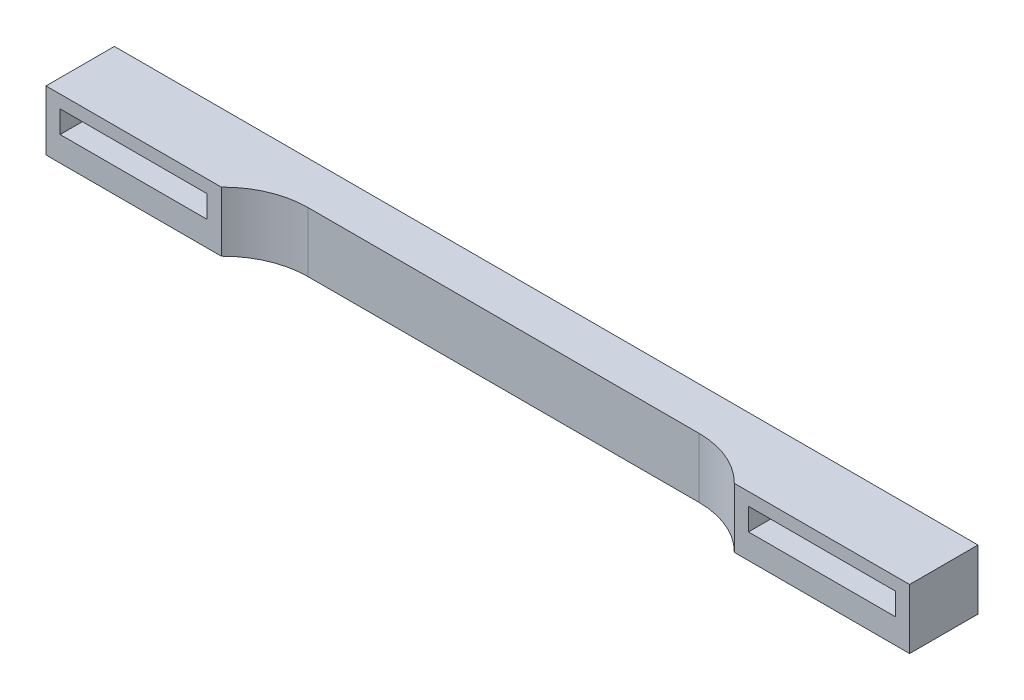
ISO-10303-21;
HEADER;
FILE_DESCRIPTION(('STEP AP214'),'2;1');
FILE_NAME('part.step','',(''),(''),'','','');
FILE_SCHEMA(('AUTOMOTIVE_DESIGN { 1 0 10303 214 1 1 1 1 }'));
ENDSEC;
DATA;
#1=APPLICATION_CONTEXT('core data for automotive mechanical design processes');
#2=APPLICATION_PROTOCOL_DEFINITION('international standard','automotive_design',2000,#1);
#3=PRODUCT_CONTEXT('',#1,'mechanical');
#4=PRODUCT('Part','Part','',(#3));
#5=PRODUCT_RELATED_PRODUCT_CATEGORY('part','',(#4));
#6=PRODUCT_DEFINITION_FORMATION('','',#4);
#7=PRODUCT_DEFINITION_CONTEXT('part definition',#1,'design');
#8=PRODUCT_DEFINITION('design','',#6,#7);
#9=PRODUCT_DEFINITION_SHAPE('','',#8);
#10=(LENGTH_UNIT() NAMED_UNIT(*) SI_UNIT(.MILLI.,.METRE.));
#11=(NAMED_UNIT(*) PLANE_ANGLE_UNIT() SI_UNIT($,.RADIAN.));
#12=(NAMED_UNIT(*) SI_UNIT($,.STERADIAN.) SOLID_ANGLE_UNIT());
#13=UNCERTAINTY_MEASURE_WITH_UNIT(LENGTH_MEASURE(1.E-05),#10,'distance_accuracy_value','');
#14=(GEOMETRIC_REPRESENTATION_CONTEXT(3) GLOBAL_UNCERTAINTY_ASSIGNED_CONTEXT((#13)) GLOBAL_UNIT_ASSIGNED_CONTEXT((#10,
#11,#12)) REPRESENTATION_CONTEXT('',''));
#15=CARTESIAN_POINT('',(0.,0.,0.));
#16=DIRECTION('',(0.,0.,1.));
#17=DIRECTION('',(1.,0.,0.));
#18=AXIS2_PLACEMENT_3D('',#15,#16,#17);
#19=CARTESIAN_POINT('',(0.,0.,0.));
#20=DIRECTION('',(0.,1.,0.));
#21=DIRECTION('',(0.,0.,1.));
#22=AXIS2_PLACEMENT_3D('',#19,#20,#21);
#23=PLANE('',#22);
#24=CARTESIAN_POINT('',(40.25,0.,-1.00000000000022));
#25=DIRECTION('',(0.,1.,0.));
#26=DIRECTION('',(0.,0.,1.));
#27=AXIS2_PLACEMENT_3D('',#24,#25,#26);
#28=CIRCLE('',#27,1.7);
#29=CARTESIAN_POINT('',(40.25,0.,0.69999999999978));
#30=VERTEX_POINT('',#29);
#31=EDGE_CURVE('E293',#30,#30,#28,.T.);
#32=ORIENTED_EDGE('',*,*,#31,.T.);
#33=EDGE_LOOP('',(#32));
#34=FACE_BOUND('',#33,.T.);
#35=CARTESIAN_POINT('',(-40.25,0.,-0.999999999999995));
#36=DIRECTION('',(0.,1.,0.));
#37=DIRECTION('',(0.,0.,1.));
#38=AXIS2_PLACEMENT_3D('',#35,#36,#37);
#39=CIRCLE('',#38,1.7);
#40=CARTESIAN_POINT('',(-40.25,0.,0.700000000000001));
#41=VERTEX_POINT('',#40);
#42=EDGE_CURVE('E290',#41,#41,#39,.T.);
#43=ORIENTED_EDGE('',*,*,#42,.T.);
#44=EDGE_LOOP('',(#43));
#45=FACE_BOUND('',#44,.T.);
#46=DIRECTION('',(1.,0.,0.));
#47=VECTOR('',#46,1.);
#48=CARTESIAN_POINT('',(0.,0.,-4.99999999999999));
#49=LINE('',#48,#47);
#50=CARTESIAN_POINT('',(-50.5,0.,-4.99999999999999));
#51=VERTEX_POINT('',#50);
#52=CARTESIAN_POINT('',(50.5,0.,-5.));
#53=VERTEX_POINT('',#52);
#54=EDGE_CURVE('E225',#51,#53,#49,.T.);
#55=ORIENTED_EDGE('',*,*,#54,.T.);
#56=DIRECTION('',(0.,0.,1.));
#57=VECTOR('',#56,1.);
#58=CARTESIAN_POINT('',(50.5,0.,0.));
#59=LINE('',#58,#57);
#60=CARTESIAN_POINT('',(50.5,0.,3.));
#61=VERTEX_POINT('',#60);
#62=EDGE_CURVE('E230',#53,#61,#59,.T.);
#63=ORIENTED_EDGE('',*,*,#62,.T.);
#64=DIRECTION('',(-1.,0.,0.));
#65=VECTOR('',#64,1.);
#66=CARTESIAN_POINT('',(0.,0.,3.00000000000001));
#67=LINE('',#66,#65);
#68=CARTESIAN_POINT('',(30.,0.,3.));
#69=VERTEX_POINT('',#68);
#70=EDGE_CURVE('E256',#61,#69,#67,.T.);
#71=ORIENTED_EDGE('',*,*,#70,.T.);
#72=CARTESIAN_POINT('',(22.8585715714571,0.,9.99999999999999));
#73=DIRECTION('',(0.,1.,0.));
#74=DIRECTION('',(0.,0.,1.));
#75=AXIS2_PLACEMENT_3D('',#72,#73,#74);
#76=CIRCLE('',#75,10.);
#77=CARTESIAN_POINT('',(22.8585715714571,0.,0.));
#78=VERTEX_POINT('',#77);
#79=EDGE_CURVE('E286',#69,#78,#76,.T.);
#80=ORIENTED_EDGE('',*,*,#79,.T.);
#81=DIRECTION('',(-1.,0.,0.));
#82=VECTOR('',#81,1.);
#83=CARTESIAN_POINT('',(0.,0.,0.));
#84=LINE('',#83,#82);
#85=CARTESIAN_POINT('',(-22.8585715714572,0.,0.));
#86=VERTEX_POINT('',#85);
#87=EDGE_CURVE('E253',#78,#86,#84,.T.);
#88=ORIENTED_EDGE('',*,*,#87,.T.);
#89=CARTESIAN_POINT('',(-22.8585715714572,0.,10.));
#90=DIRECTION('',(0.,1.,0.));
#91=DIRECTION('',(0.,0.,1.));
#92=AXIS2_PLACEMENT_3D('',#89,#90,#91);
#93=CIRCLE('',#92,10.);
#94=CARTESIAN_POINT('',(-30.,0.,3.00000000000001));
#95=VERTEX_POINT('',#94);
#96=EDGE_CURVE('E283',#86,#95,#93,.T.);
#97=ORIENTED_EDGE('',*,*,#96,.T.);
#98=DIRECTION('',(-1.,0.,0.));
#99=VECTOR('',#98,1.);
#100=CARTESIAN_POINT('',(0.,0.,3.00000000000001));
#101=LINE('',#100,#99);
#102=CARTESIAN_POINT('',(-50.5,0.,3.00000000000001));
#103=VERTEX_POINT('',#102);
#104=EDGE_CURVE('E250',#95,#103,#101,.T.);
#105=ORIENTED_EDGE('',*,*,#104,.T.);
#106=DIRECTION('',(0.,0.,-1.));
#107=VECTOR('',#106,1.);
#108=CARTESIAN_POINT('',(-50.5,0.,0.));
#109=LINE('',#108,#107);
#110=EDGE_CURVE('E247',#103,#51,#109,.T.);
#111=ORIENTED_EDGE('',*,*,#110,.T.);
#112=EDGE_LOOP('',(#55,#63,#71,#80,#88,#97,#105,#111));
#113=FACE_BOUND('',#112,.T.);
#114=ADVANCED_FACE('F34',(#34,#45,#113),#23,.F.);
#115=CARTESIAN_POINT('',(0.,7.,-4.99999999999999));
#116=DIRECTION('',(0.,0.,-1.));
#117=DIRECTION('',(-1.,0.,0.));
#118=AXIS2_PLACEMENT_3D('',#115,#116,#117);
#119=PLANE('',#118);
#120=DIRECTION('',(0.,-1.,0.));
#121=VECTOR('',#120,1.);
#122=CARTESIAN_POINT('',(-31.65,7.,-4.99999999999999));
#123=LINE('',#122,#121);
#124=CARTESIAN_POINT('',(-31.65,5.50000000000001,-4.99999999999999));
#125=VERTEX_POINT('',#124);
#126=CARTESIAN_POINT('',(-31.65,2.9,-4.99999999999999));
#127=VERTEX_POINT('',#126);
#128=EDGE_CURVE('E223',#125,#127,#123,.T.);
#129=ORIENTED_EDGE('',*,*,#128,.F.);
#130=DIRECTION('',(1.,0.,0.));
#131=VECTOR('',#130,1.);
#132=CARTESIAN_POINT('',(0.,5.50000000000001,-4.99999999999999));
#133=LINE('',#132,#131);
#134=CARTESIAN_POINT('',(-48.85,5.5,-4.99999999999999));
#135=VERTEX_POINT('',#134);
#136=EDGE_CURVE('E218',#135,#125,#133,.T.);
#137=ORIENTED_EDGE('',*,*,#136,.F.);
#138=DIRECTION('',(0.,1.,0.));
#139=VECTOR('',#138,1.);
#140=CARTESIAN_POINT('',(-48.85,7.,-4.99999999999999));
#141=LINE('',#140,#139);
#142=CARTESIAN_POINT('',(-48.85,2.9,-4.99999999999999));
#143=VERTEX_POINT('',#142);
#144=EDGE_CURVE('E157',#143,#135,#141,.T.);
#145=ORIENTED_EDGE('',*,*,#144,.F.);
#146=DIRECTION('',(-1.,0.,0.));
#147=VECTOR('',#146,1.);
#148=CARTESIAN_POINT('',(0.,2.9,-4.99999999999999));
#149=LINE('',#148,#147);
#150=EDGE_CURVE('E221',#127,#143,#149,.T.);
#151=ORIENTED_EDGE('',*,*,#150,.F.);
#152=EDGE_LOOP('',(#129,#137,#145,#151));
#153=FACE_BOUND('',#152,.T.);
#154=ORIENTED_EDGE('',*,*,#54,.F.);
#155=DIRECTION('',(0.,-1.,0.));
#156=VECTOR('',#155,1.);
#157=CARTESIAN_POINT('',(-50.5,7.,-4.99999999999999));
#158=LINE('',#157,#156);
#159=CARTESIAN_POINT('',(-50.5,7.,-4.99999999999999));
#160=VERTEX_POINT('',#159);
#161=EDGE_CURVE('E272',#160,#51,#158,.T.);
#162=ORIENTED_EDGE('',*,*,#161,.F.);
#163=DIRECTION('',(1.,0.,0.));
#164=VECTOR('',#163,1.);
#165=CARTESIAN_POINT('',(0.,7.,-4.99999999999999));
#166=LINE('',#165,#164);
#167=CARTESIAN_POINT('',(50.5,7.,-5.));
#168=VERTEX_POINT('',#167);
#169=EDGE_CURVE('E226',#160,#168,#166,.T.);
#170=ORIENTED_EDGE('',*,*,#169,.T.);
#171=DIRECTION('',(0.,-1.,0.));
#172=VECTOR('',#171,1.);
#173=CARTESIAN_POINT('',(50.5,7.,-5.));
#174=LINE('',#173,#172);
#175=EDGE_CURVE('E244',#168,#53,#174,.T.);
#176=ORIENTED_EDGE('',*,*,#175,.T.);
#177=EDGE_LOOP('',(#154,#162,#170,#176));
#178=FACE_BOUND('',#177,.T.);
#179=DIRECTION('',(0.,-1.,0.));
#180=VECTOR('',#179,1.);
#181=CARTESIAN_POINT('',(31.65,7.,-4.99999999999999));
#182=LINE('',#181,#180);
#183=CARTESIAN_POINT('',(31.65,5.50000000000001,-4.99999999999999));
#184=VERTEX_POINT('',#183);
#185=CARTESIAN_POINT('',(31.65,2.9,-4.99999999999999));
#186=VERTEX_POINT('',#185);
#187=EDGE_CURVE('E212',#184,#186,#182,.T.);
#188=ORIENTED_EDGE('',*,*,#187,.T.);
#189=DIRECTION('',(1.,0.,0.));
#190=VECTOR('',#189,1.);
#191=CARTESIAN_POINT('',(0.,2.9,-4.99999999999999));
#192=LINE('',#191,#190);
#193=CARTESIAN_POINT('',(48.85,2.9,-4.99999999999999));
#194=VERTEX_POINT('',#193);
#195=EDGE_CURVE('E215',#186,#194,#192,.T.);
#196=ORIENTED_EDGE('',*,*,#195,.T.);
#197=DIRECTION('',(0.,1.,0.));
#198=VECTOR('',#197,1.);
#199=CARTESIAN_POINT('',(48.85,7.,-4.99999999999999));
#200=LINE('',#199,#198);
#201=CARTESIAN_POINT('',(48.85,5.5,-4.99999999999999));
#202=VERTEX_POINT('',#201);
#203=EDGE_CURVE('E182',#194,#202,#200,.T.);
#204=ORIENTED_EDGE('',*,*,#203,.T.);
#205=DIRECTION('',(-1.,0.,0.));
#206=VECTOR('',#205,1.);
#207=CARTESIAN_POINT('',(0.,5.50000000000001,-4.99999999999999));
#208=LINE('',#207,#206);
#209=EDGE_CURVE('E209',#202,#184,#208,.T.);
#210=ORIENTED_EDGE('',*,*,#209,.T.);
#211=EDGE_LOOP('',(#188,#196,#204,#210));
#212=FACE_BOUND('',#211,.T.);
#213=ADVANCED_FACE('F309',(#153,#178,#212),#119,.T.);
#214=CARTESIAN_POINT('',(0.,7.,3.00000000000001));
#215=DIRECTION('',(0.,0.,1.));
#216=DIRECTION('',(1.,0.,0.));
#217=AXIS2_PLACEMENT_3D('',#214,#215,#216);
#218=PLANE('',#217);
#219=ORIENTED_EDGE('',*,*,#70,.F.);
#220=DIRECTION('',(0.,-1.,0.));
#221=VECTOR('',#220,1.);
#222=CARTESIAN_POINT('',(50.5,7.,3.));
#223=LINE('',#222,#221);
#224=CARTESIAN_POINT('',(50.5,7.,3.));
#225=VERTEX_POINT('',#224);
#226=EDGE_CURVE('E262',#225,#61,#223,.T.);
#227=ORIENTED_EDGE('',*,*,#226,.F.);
#228=DIRECTION('',(-1.,0.,0.));
#229=VECTOR('',#228,1.);
#230=CARTESIAN_POINT('',(0.,7.,3.00000000000001));
#231=LINE('',#230,#229);
#232=CARTESIAN_POINT('',(30.,7.,3.));
#233=VERTEX_POINT('',#232);
#234=EDGE_CURVE('E238',#225,#233,#231,.T.);
#235=ORIENTED_EDGE('',*,*,#234,.T.);
#236=DIRECTION('',(0.,-1.,0.));
#237=VECTOR('',#236,1.);
#238=CARTESIAN_POINT('',(30.,7.,3.));
#239=LINE('',#238,#237);
#240=EDGE_CURVE('E264',#233,#69,#239,.T.);
#241=ORIENTED_EDGE('',*,*,#240,.T.);
#242=EDGE_LOOP('',(#219,#227,#235,#241));
#243=FACE_BOUND('',#242,.T.);
#244=DIRECTION('',(0.,-1.,0.));
#245=VECTOR('',#244,1.);
#246=CARTESIAN_POINT('',(48.85,0.,3.00000000000001));
#247=LINE('',#246,#245);
#248=CARTESIAN_POINT('',(48.85,5.5,3.00000000000001));
#249=VERTEX_POINT('',#248);
#250=CARTESIAN_POINT('',(48.85,2.9,3.));
#251=VERTEX_POINT('',#250);
#252=EDGE_CURVE('E188',#249,#251,#247,.T.);
#253=ORIENTED_EDGE('',*,*,#252,.T.);
#254=DIRECTION('',(-1.,0.,0.));
#255=VECTOR('',#254,1.);
#256=CARTESIAN_POINT('',(0.,2.9,3.00000000000001));
#257=LINE('',#256,#255);
#258=CARTESIAN_POINT('',(31.65,2.9,3.00000000000001));
#259=VERTEX_POINT('',#258);
#260=EDGE_CURVE('E185',#251,#259,#257,.T.);
#261=ORIENTED_EDGE('',*,*,#260,.T.);
#262=DIRECTION('',(0.,1.,0.));
#263=VECTOR('',#262,1.);
#264=CARTESIAN_POINT('',(31.65,0.,3.00000000000001));
#265=LINE('',#264,#263);
#266=CARTESIAN_POINT('',(31.65,5.50000000000001,3.00000000000001));
#267=VERTEX_POINT('',#266);
#268=EDGE_CURVE('E195',#259,#267,#265,.T.);
#269=ORIENTED_EDGE('',*,*,#268,.T.);
#270=DIRECTION('',(1.,0.,0.));
#271=VECTOR('',#270,1.);
#272=CARTESIAN_POINT('',(0.,5.50000000000001,3.00000000000001));
#273=LINE('',#272,#271);
#274=EDGE_CURVE('E192',#267,#249,#273,.T.);
#275=ORIENTED_EDGE('',*,*,#274,.T.);
#276=EDGE_LOOP('',(#253,#261,#269,#275));
#277=FACE_BOUND('',#276,.T.);
#278=ADVANCED_FACE('F323',(#243,#277),#218,.T.);
#279=CARTESIAN_POINT('',(-50.5,7.,0.));
#280=DIRECTION('',(-1.,0.,0.));
#281=DIRECTION('',(0.,0.,1.));
#282=AXIS2_PLACEMENT_3D('',#279,#280,#281);
#283=PLANE('',#282);
#284=ORIENTED_EDGE('',*,*,#110,.F.);
#285=DIRECTION('',(0.,-1.,0.));
#286=VECTOR('',#285,1.);
#287=CARTESIAN_POINT('',(-50.5,7.,3.00000000000001));
#288=LINE('',#287,#286);
#289=CARTESIAN_POINT('',(-50.5,7.,3.00000000000001));
#290=VERTEX_POINT('',#289);
#291=EDGE_CURVE('E270',#290,#103,#288,.T.);
#292=ORIENTED_EDGE('',*,*,#291,.F.);
#293=DIRECTION('',(0.,0.,-1.));
#294=VECTOR('',#293,1.);
#295=CARTESIAN_POINT('',(-50.5,7.,0.));
#296=LINE('',#295,#294);
#297=EDGE_CURVE('E229',#290,#160,#296,.T.);
#298=ORIENTED_EDGE('',*,*,#297,.T.);
#299=ORIENTED_EDGE('',*,*,#161,.T.);
#300=EDGE_LOOP('',(#284,#292,#298,#299));
#301=FACE_BOUND('',#300,.T.);
#302=ADVANCED_FACE('F337',(#301),#283,.T.);
#303=CARTESIAN_POINT('',(0.,7.,3.00000000000001));
#304=DIRECTION('',(0.,0.,1.));
#305=DIRECTION('',(1.,0.,0.));
#306=AXIS2_PLACEMENT_3D('',#303,#304,#305);
#307=PLANE('',#306);
#308=DIRECTION('',(0.,1.,0.));
#309=VECTOR('',#308,1.);
#310=CARTESIAN_POINT('',(-31.65,0.,3.00000000000001));
#311=LINE('',#310,#309);
#312=CARTESIAN_POINT('',(-31.65,2.9,3.00000000000001));
#313=VERTEX_POINT('',#312);
#314=CARTESIAN_POINT('',(-31.65,5.50000000000001,3.00000000000001));
#315=VERTEX_POINT('',#314);
#316=EDGE_CURVE('E170',#313,#315,#311,.T.);
#317=ORIENTED_EDGE('',*,*,#316,.F.);
#318=DIRECTION('',(1.,0.,0.));
#319=VECTOR('',#318,1.);
#320=CARTESIAN_POINT('',(0.,2.9,3.00000000000001));
#321=LINE('',#320,#319);
#322=CARTESIAN_POINT('',(-48.85,2.9,3.00000000000001));
#323=VERTEX_POINT('',#322);
#324=EDGE_CURVE('E175',#323,#313,#321,.T.);
#325=ORIENTED_EDGE('',*,*,#324,.F.);
#326=DIRECTION('',(0.,-1.,0.));
#327=VECTOR('',#326,1.);
#328=CARTESIAN_POINT('',(-48.85,0.,3.00000000000001));
#329=LINE('',#328,#327);
#330=CARTESIAN_POINT('',(-48.85,5.5,3.00000000000001));
#331=VERTEX_POINT('',#330);
#332=EDGE_CURVE('E154',#331,#323,#329,.T.);
#333=ORIENTED_EDGE('',*,*,#332,.F.);
#334=DIRECTION('',(-1.,0.,0.));
#335=VECTOR('',#334,1.);
#336=CARTESIAN_POINT('',(0.,5.50000000000001,3.00000000000001));
#337=LINE('',#336,#335);
#338=EDGE_CURVE('E165',#315,#331,#337,.T.);
#339=ORIENTED_EDGE('',*,*,#338,.F.);
#340=EDGE_LOOP('',(#317,#325,#333,#339));
#341=FACE_BOUND('',#340,.T.);
#342=ORIENTED_EDGE('',*,*,#104,.F.);
#343=DIRECTION('',(0.,-1.,0.));
#344=VECTOR('',#343,1.);
#345=CARTESIAN_POINT('',(-30.,7.,3.00000000000001));
#346=LINE('',#345,#344);
#347=CARTESIAN_POINT('',(-30.,7.,3.00000000000001));
#348=VERTEX_POINT('',#347);
#349=EDGE_CURVE('E267',#348,#95,#346,.T.);
#350=ORIENTED_EDGE('',*,*,#349,.F.);
#351=DIRECTION('',(-1.,0.,0.));
#352=VECTOR('',#351,1.);
#353=CARTESIAN_POINT('',(0.,7.,3.00000000000001));
#354=LINE('',#353,#352);
#355=EDGE_CURVE('E233',#348,#290,#354,.T.);
#356=ORIENTED_EDGE('',*,*,#355,.T.);
#357=ORIENTED_EDGE('',*,*,#291,.T.);
#358=EDGE_LOOP('',(#342,#350,#356,#357));
#359=FACE_BOUND('',#358,.T.);
#360=ADVANCED_FACE('F172',(#341,#359),#307,.T.);
#361=CARTESIAN_POINT('',(0.,7.,0.));
#362=DIRECTION('',(0.,0.,1.));
#363=DIRECTION('',(1.,0.,0.));
#364=AXIS2_PLACEMENT_3D('',#361,#362,#363);
#365=PLANE('',#364);
#366=DIRECTION('',(-1.,0.,0.));
#367=VECTOR('',#366,1.);
#368=CARTESIAN_POINT('',(0.,7.,0.));
#369=LINE('',#368,#367);
#370=CARTESIAN_POINT('',(22.8585715714571,7.,0.));
#371=VERTEX_POINT('',#370);
#372=CARTESIAN_POINT('',(-22.8585715714572,7.,0.));
#373=VERTEX_POINT('',#372);
#374=EDGE_CURVE('E236',#371,#373,#369,.T.);
#375=ORIENTED_EDGE('',*,*,#374,.T.);
#376=DIRECTION('',(0.,1.,0.));
#377=VECTOR('',#376,1.);
#378=CARTESIAN_POINT('',(-22.8585715714572,0.,0.));
#379=LINE('',#378,#377);
#380=EDGE_CURVE('E280',#373,#86,#379,.F.);
#381=ORIENTED_EDGE('',*,*,#380,.T.);
#382=ORIENTED_EDGE('',*,*,#87,.F.);
#383=DIRECTION('',(0.,-1.,0.));
#384=VECTOR('',#383,1.);
#385=CARTESIAN_POINT('',(22.8585715714571,7.,0.));
#386=LINE('',#385,#384);
#387=EDGE_CURVE('E56',#78,#371,#386,.F.);
#388=ORIENTED_EDGE('',*,*,#387,.T.);
#389=EDGE_LOOP('',(#375,#381,#382,#388));
#390=FACE_BOUND('',#389,.T.);
#391=ADVANCED_FACE('F327',(#390),#365,.T.);
#392=CARTESIAN_POINT('',(50.5,7.,0.));
#393=DIRECTION('',(1.,0.,0.));
#394=DIRECTION('',(0.,0.,-1.));
#395=AXIS2_PLACEMENT_3D('',#392,#393,#394);
#396=PLANE('',#395);
#397=ORIENTED_EDGE('',*,*,#62,.F.);
#398=ORIENTED_EDGE('',*,*,#175,.F.);
#399=DIRECTION('',(0.,0.,1.));
#400=VECTOR('',#399,1.);
#401=CARTESIAN_POINT('',(50.5,7.,0.));
#402=LINE('',#401,#400);
#403=EDGE_CURVE('E241',#168,#225,#402,.T.);
#404=ORIENTED_EDGE('',*,*,#403,.T.);
#405=ORIENTED_EDGE('',*,*,#226,.T.);
#406=EDGE_LOOP('',(#397,#398,#404,#405));
#407=FACE_BOUND('',#406,.T.);
#408=ADVANCED_FACE('F318',(#407),#396,.T.);
#409=CARTESIAN_POINT('',(0.,7.,0.));
#410=DIRECTION('',(0.,1.,0.));
#411=DIRECTION('',(0.,0.,1.));
#412=AXIS2_PLACEMENT_3D('',#409,#410,#411);
#413=PLANE('',#412);
#414=ORIENTED_EDGE('',*,*,#169,.F.);
#415=ORIENTED_EDGE('',*,*,#297,.F.);
#416=ORIENTED_EDGE('',*,*,#355,.F.);
#417=CARTESIAN_POINT('',(-22.8585715714572,7.,10.));
#418=DIRECTION('',(0.,1.,0.));
#419=DIRECTION('',(0.,0.,1.));
#420=AXIS2_PLACEMENT_3D('',#417,#418,#419);
#421=CIRCLE('',#420,10.);
#422=EDGE_CURVE('E49',#348,#373,#421,.F.);
#423=ORIENTED_EDGE('',*,*,#422,.T.);
#424=ORIENTED_EDGE('',*,*,#374,.F.);
#425=CARTESIAN_POINT('',(22.8585715714571,7.,9.99999999999999));
#426=DIRECTION('',(0.,1.,0.));
#427=DIRECTION('',(0.,0.,1.));
#428=AXIS2_PLACEMENT_3D('',#425,#426,#427);
#429=CIRCLE('',#428,10.);
#430=EDGE_CURVE('E288',#371,#233,#429,.F.);
#431=ORIENTED_EDGE('',*,*,#430,.T.);
#432=ORIENTED_EDGE('',*,*,#234,.F.);
#433=ORIENTED_EDGE('',*,*,#403,.F.);
#434=EDGE_LOOP('',(#414,#415,#416,#423,#424,#431,#432,#433));
#435=FACE_BOUND('',#434,.T.);
#436=ADVANCED_FACE('F331',(#435),#413,.T.);
#437=CARTESIAN_POINT('',(0.,2.9,-8.99999999999999));
#438=DIRECTION('',(0.,1.,0.));
#439=DIRECTION('',(0.,0.,1.));
#440=AXIS2_PLACEMENT_3D('',#437,#438,#439);
#441=PLANE('',#440);
#442=CARTESIAN_POINT('',(40.25,2.9,-1.00000000000022));
#443=DIRECTION('',(0.,1.,0.));
#444=DIRECTION('',(0.,0.,1.));
#445=AXIS2_PLACEMENT_3D('',#442,#443,#444);
#446=CIRCLE('',#445,1.4);
#447=CARTESIAN_POINT('',(40.25,2.9,0.39999999999978));
#448=VERTEX_POINT('',#447);
#449=EDGE_CURVE('E189',#448,#448,#446,.F.);
#450=ORIENTED_EDGE('',*,*,#449,.T.);
#451=EDGE_LOOP('',(#450));
#452=FACE_BOUND('',#451,.T.);
#453=DIRECTION('',(0.,0.,1.));
#454=VECTOR('',#453,1.);
#455=CARTESIAN_POINT('',(31.65,2.9,-8.99999999999999));
#456=LINE('',#455,#454);
#457=EDGE_CURVE('E199',#186,#259,#456,.T.);
#458=ORIENTED_EDGE('',*,*,#457,.T.);
#459=ORIENTED_EDGE('',*,*,#260,.F.);
#460=DIRECTION('',(0.,0.,1.));
#461=VECTOR('',#460,1.);
#462=CARTESIAN_POINT('',(48.85,2.9,-8.99999999999999));
#463=LINE('',#462,#461);
#464=EDGE_CURVE('E198',#194,#251,#463,.T.);
#465=ORIENTED_EDGE('',*,*,#464,.F.);
#466=ORIENTED_EDGE('',*,*,#195,.F.);
#467=EDGE_LOOP('',(#458,#459,#465,#466));
#468=FACE_BOUND('',#467,.T.);
#469=ADVANCED_FACE('F354',(#452,#468),#441,.T.);
#470=CARTESIAN_POINT('',(31.65,0.,-8.99999999999999));
#471=DIRECTION('',(1.,0.,0.));
#472=DIRECTION('',(0.,0.,-1.));
#473=AXIS2_PLACEMENT_3D('',#470,#471,#472);
#474=PLANE('',#473);
#475=DIRECTION('',(0.,0.,1.));
#476=VECTOR('',#475,1.);
#477=CARTESIAN_POINT('',(31.65,5.50000000000001,-8.99999999999999));
#478=LINE('',#477,#476);
#479=EDGE_CURVE('E201',#184,#267,#478,.T.);
#480=ORIENTED_EDGE('',*,*,#479,.T.);
#481=ORIENTED_EDGE('',*,*,#268,.F.);
#482=ORIENTED_EDGE('',*,*,#457,.F.);
#483=ORIENTED_EDGE('',*,*,#187,.F.);
#484=EDGE_LOOP('',(#480,#481,#482,#483));
#485=FACE_BOUND('',#484,.T.);
#486=ADVANCED_FACE('F346',(#485),#474,.T.);
#487=CARTESIAN_POINT('',(0.,5.50000000000001,-8.99999999999999));
#488=DIRECTION('',(0.,-1.,0.));
#489=DIRECTION('',(1.,0.,0.));
#490=AXIS2_PLACEMENT_3D('',#487,#488,#489);
#491=PLANE('',#490);
#492=DIRECTION('',(0.,0.,1.));
#493=VECTOR('',#492,1.);
#494=CARTESIAN_POINT('',(48.85,5.5,-8.99999999999999));
#495=LINE('',#494,#493);
#496=EDGE_CURVE('E203',#202,#249,#495,.T.);
#497=ORIENTED_EDGE('',*,*,#496,.T.);
#498=ORIENTED_EDGE('',*,*,#274,.F.);
#499=ORIENTED_EDGE('',*,*,#479,.F.);
#500=ORIENTED_EDGE('',*,*,#209,.F.);
#501=EDGE_LOOP('',(#497,#498,#499,#500));
#502=FACE_BOUND('',#501,.T.);
#503=ADVANCED_FACE('F350',(#502),#491,.T.);
#504=CARTESIAN_POINT('',(48.85,0.,-8.99999999999999));
#505=DIRECTION('',(-1.,0.,0.));
#506=DIRECTION('',(0.,0.,1.));
#507=AXIS2_PLACEMENT_3D('',#504,#505,#506);
#508=PLANE('',#507);
#509=ORIENTED_EDGE('',*,*,#464,.T.);
#510=ORIENTED_EDGE('',*,*,#252,.F.);
#511=ORIENTED_EDGE('',*,*,#496,.F.);
#512=ORIENTED_EDGE('',*,*,#203,.F.);
#513=EDGE_LOOP('',(#509,#510,#511,#512));
#514=FACE_BOUND('',#513,.T.);
#515=ADVANCED_FACE('F356',(#514),#508,.T.);
#516=CARTESIAN_POINT('',(-31.65,0.,-8.99999999999999));
#517=DIRECTION('',(1.,0.,0.));
#518=DIRECTION('',(0.,0.,-1.));
#519=AXIS2_PLACEMENT_3D('',#516,#517,#518);
#520=PLANE('',#519);
#521=ORIENTED_EDGE('',*,*,#128,.T.);
#522=DIRECTION('',(0.,0.,1.));
#523=VECTOR('',#522,1.);
#524=CARTESIAN_POINT('',(-31.65,2.9,-8.99999999999999));
#525=LINE('',#524,#523);
#526=EDGE_CURVE('E180',#127,#313,#525,.T.);
#527=ORIENTED_EDGE('',*,*,#526,.T.);
#528=ORIENTED_EDGE('',*,*,#316,.T.);
#529=DIRECTION('',(0.,0.,1.));
#530=VECTOR('',#529,1.);
#531=CARTESIAN_POINT('',(-31.65,5.50000000000001,-8.99999999999999));
#532=LINE('',#531,#530);
#533=EDGE_CURVE('E161',#125,#315,#532,.T.);
#534=ORIENTED_EDGE('',*,*,#533,.F.);
#535=EDGE_LOOP('',(#521,#527,#528,#534));
#536=FACE_BOUND('',#535,.T.);
#537=ADVANCED_FACE('F358',(#536),#520,.F.);
#538=CARTESIAN_POINT('',(0.,2.9,-8.99999999999999));
#539=DIRECTION('',(0.,-1.,0.));
#540=DIRECTION('',(0.,0.,-1.));
#541=AXIS2_PLACEMENT_3D('',#538,#539,#540);
#542=PLANE('',#541);
#543=CARTESIAN_POINT('',(-40.25,2.9,-0.999999999999995));
#544=DIRECTION('',(0.,-1.,0.));
#545=DIRECTION('',(0.,0.,-1.));
#546=AXIS2_PLACEMENT_3D('',#543,#544,#545);
#547=CIRCLE('',#546,1.4);
#548=CARTESIAN_POINT('',(-40.25,2.9,-2.39999999999999));
#549=VERTEX_POINT('',#548);
#550=EDGE_CURVE('E274',#549,#549,#547,.T.);
#551=ORIENTED_EDGE('',*,*,#550,.T.);
#552=EDGE_LOOP('',(#551));
#553=FACE_BOUND('',#552,.T.);
#554=ORIENTED_EDGE('',*,*,#150,.T.);
#555=DIRECTION('',(0.,0.,1.));
#556=VECTOR('',#555,1.);
#557=CARTESIAN_POINT('',(-48.85,2.9,-8.99999999999999));
#558=LINE('',#557,#556);
#559=EDGE_CURVE('E160',#143,#323,#558,.T.);
#560=ORIENTED_EDGE('',*,*,#559,.T.);
#561=ORIENTED_EDGE('',*,*,#324,.T.);
#562=ORIENTED_EDGE('',*,*,#526,.F.);
#563=EDGE_LOOP('',(#554,#560,#561,#562));
#564=FACE_BOUND('',#563,.T.);
#565=ADVANCED_FACE('F364',(#553,#564),#542,.F.);
#566=CARTESIAN_POINT('',(-48.85,0.,-8.99999999999999));
#567=DIRECTION('',(-1.,0.,0.));
#568=DIRECTION('',(0.,0.,1.));
#569=AXIS2_PLACEMENT_3D('',#566,#567,#568);
#570=PLANE('',#569);
#571=ORIENTED_EDGE('',*,*,#144,.T.);
#572=DIRECTION('',(0.,0.,1.));
#573=VECTOR('',#572,1.);
#574=CARTESIAN_POINT('',(-48.85,5.5,-8.99999999999999));
#575=LINE('',#574,#573);
#576=EDGE_CURVE('E149',#135,#331,#575,.T.);
#577=ORIENTED_EDGE('',*,*,#576,.T.);
#578=ORIENTED_EDGE('',*,*,#332,.T.);
#579=ORIENTED_EDGE('',*,*,#559,.F.);
#580=EDGE_LOOP('',(#571,#577,#578,#579));
#581=FACE_BOUND('',#580,.T.);
#582=ADVANCED_FACE('F151',(#581),#570,.F.);
#583=CARTESIAN_POINT('',(0.,5.50000000000001,-8.99999999999999));
#584=DIRECTION('',(0.,1.,0.));
#585=DIRECTION('',(-1.,0.,0.));
#586=AXIS2_PLACEMENT_3D('',#583,#584,#585);
#587=PLANE('',#586);
#588=ORIENTED_EDGE('',*,*,#136,.T.);
#589=ORIENTED_EDGE('',*,*,#533,.T.);
#590=ORIENTED_EDGE('',*,*,#338,.T.);
#591=ORIENTED_EDGE('',*,*,#576,.F.);
#592=EDGE_LOOP('',(#588,#589,#590,#591));
#593=FACE_BOUND('',#592,.T.);
#594=ADVANCED_FACE('F166',(#593),#587,.F.);
#595=CARTESIAN_POINT('',(-40.25,3.,-0.999999999999995));
#596=DIRECTION('',(0.,-1.,0.));
#597=DIRECTION('',(0.,0.,-1.));
#598=AXIS2_PLACEMENT_3D('',#595,#596,#597);
#599=CYLINDRICAL_SURFACE('',#598,1.4);
#600=CARTESIAN_POINT('',(-40.25,0.3,-0.999999999999995));
#601=DIRECTION('',(0.,1.,0.));
#602=DIRECTION('',(0.,0.,1.));
#603=AXIS2_PLACEMENT_3D('',#600,#601,#602);
#604=CIRCLE('',#603,1.4);
#605=CARTESIAN_POINT('',(-40.25,0.3,0.400000000000001));
#606=VERTEX_POINT('',#605);
#607=EDGE_CURVE('E11',#606,#606,#604,.F.);
#608=ORIENTED_EDGE('',*,*,#607,.T.);
#609=EDGE_LOOP('',(#608));
#610=FACE_BOUND('',#609,.T.);
#611=ORIENTED_EDGE('',*,*,#550,.F.);
#612=EDGE_LOOP('',(#611));
#613=FACE_BOUND('',#612,.T.);
#614=ADVANCED_FACE('F422',(#610,#613),#599,.F.);
#615=CARTESIAN_POINT('',(40.25,3.,-1.00000000000022));
#616=DIRECTION('',(0.,-1.,0.));
#617=DIRECTION('',(0.,0.,-1.));
#618=AXIS2_PLACEMENT_3D('',#615,#616,#617);
#619=CYLINDRICAL_SURFACE('',#618,1.4);
#620=CARTESIAN_POINT('',(40.25,0.3,-1.00000000000022));
#621=DIRECTION('',(0.,1.,0.));
#622=DIRECTION('',(0.,0.,1.));
#623=AXIS2_PLACEMENT_3D('',#620,#621,#622);
#624=CIRCLE('',#623,1.4);
#625=CARTESIAN_POINT('',(40.25,0.3,0.39999999999978));
#626=VERTEX_POINT('',#625);
#627=EDGE_CURVE('E42',#626,#626,#624,.F.);
#628=ORIENTED_EDGE('',*,*,#627,.T.);
#629=EDGE_LOOP('',(#628));
#630=FACE_BOUND('',#629,.T.);
#631=ORIENTED_EDGE('',*,*,#449,.F.);
#632=EDGE_LOOP('',(#631));
#633=FACE_BOUND('',#632,.T.);
#634=ADVANCED_FACE('F298',(#630,#633),#619,.F.);
#635=CARTESIAN_POINT('',(-22.8585715714572,7.,10.));
#636=DIRECTION('',(0.,-1.,0.));
#637=DIRECTION('',(0.,0.,-1.));
#638=AXIS2_PLACEMENT_3D('',#635,#636,#637);
#639=CYLINDRICAL_SURFACE('',#638,10.);
#640=ORIENTED_EDGE('',*,*,#422,.F.);
#641=ORIENTED_EDGE('',*,*,#349,.T.);
#642=ORIENTED_EDGE('',*,*,#96,.F.);
#643=ORIENTED_EDGE('',*,*,#380,.F.);
#644=EDGE_LOOP('',(#640,#641,#642,#643));
#645=FACE_BOUND('',#644,.T.);
#646=ADVANCED_FACE('F333',(#645),#639,.F.);
#647=CARTESIAN_POINT('',(22.8585715714571,7.,9.99999999999999));
#648=DIRECTION('',(0.,1.,0.));
#649=DIRECTION('',(0.,0.,1.));
#650=AXIS2_PLACEMENT_3D('',#647,#648,#649);
#651=CYLINDRICAL_SURFACE('',#650,10.);
#652=ORIENTED_EDGE('',*,*,#430,.F.);
#653=ORIENTED_EDGE('',*,*,#387,.F.);
#654=ORIENTED_EDGE('',*,*,#79,.F.);
#655=ORIENTED_EDGE('',*,*,#240,.F.);
#656=EDGE_LOOP('',(#652,#653,#654,#655));
#657=FACE_BOUND('',#656,.T.);
#658=ADVANCED_FACE('F304',(#657),#651,.F.);
#659=CARTESIAN_POINT('',(40.25,0.3,-1.00000000000022));
#660=DIRECTION('',(0.,1.,0.));
#661=DIRECTION('',(0.,0.,1.));
#662=AXIS2_PLACEMENT_3D('',#659,#660,#661);
#663=TOROIDAL_SURFACE('',#662,1.7,0.3);
#664=ORIENTED_EDGE('',*,*,#627,.F.);
#665=EDGE_LOOP('',(#664));
#666=FACE_BOUND('',#665,.T.);
#667=ORIENTED_EDGE('',*,*,#31,.F.);
#668=EDGE_LOOP('',(#667));
#669=FACE_BOUND('',#668,.T.);
#670=ADVANCED_FACE('F301',(#666,#669),#663,.T.);
#671=CARTESIAN_POINT('',(-40.25,0.3,-0.999999999999995));
#672=DIRECTION('',(0.,1.,0.));
#673=DIRECTION('',(0.,0.,1.));
#674=AXIS2_PLACEMENT_3D('',#671,#672,#673);
#675=TOROIDAL_SURFACE('',#674,1.7,0.3);
#676=ORIENTED_EDGE('',*,*,#42,.F.);
#677=EDGE_LOOP('',(#676));
#678=FACE_BOUND('',#677,.T.);
#679=ORIENTED_EDGE('',*,*,#607,.F.);
#680=EDGE_LOOP('',(#679));
#681=FACE_BOUND('',#680,.T.);
#682=ADVANCED_FACE('F36',(#678,#681),#675,.T.);
#683=CLOSED_SHELL('',(#114,#213,#278,#302,#360,#391,#408,#436,#469,#486,#503,#515,#537,#565,
#582,#594,#614,#634,#646,#658,#670,#682));
#684=MANIFOLD_SOLID_BREP('B2',#683);
#685=ADVANCED_BREP_SHAPE_REPRESENTATION('',(#18,#684),#14);
#686=SHAPE_DEFINITION_REPRESENTATION(#9,#685);
ENDSEC;
END-ISO-10303-21;
